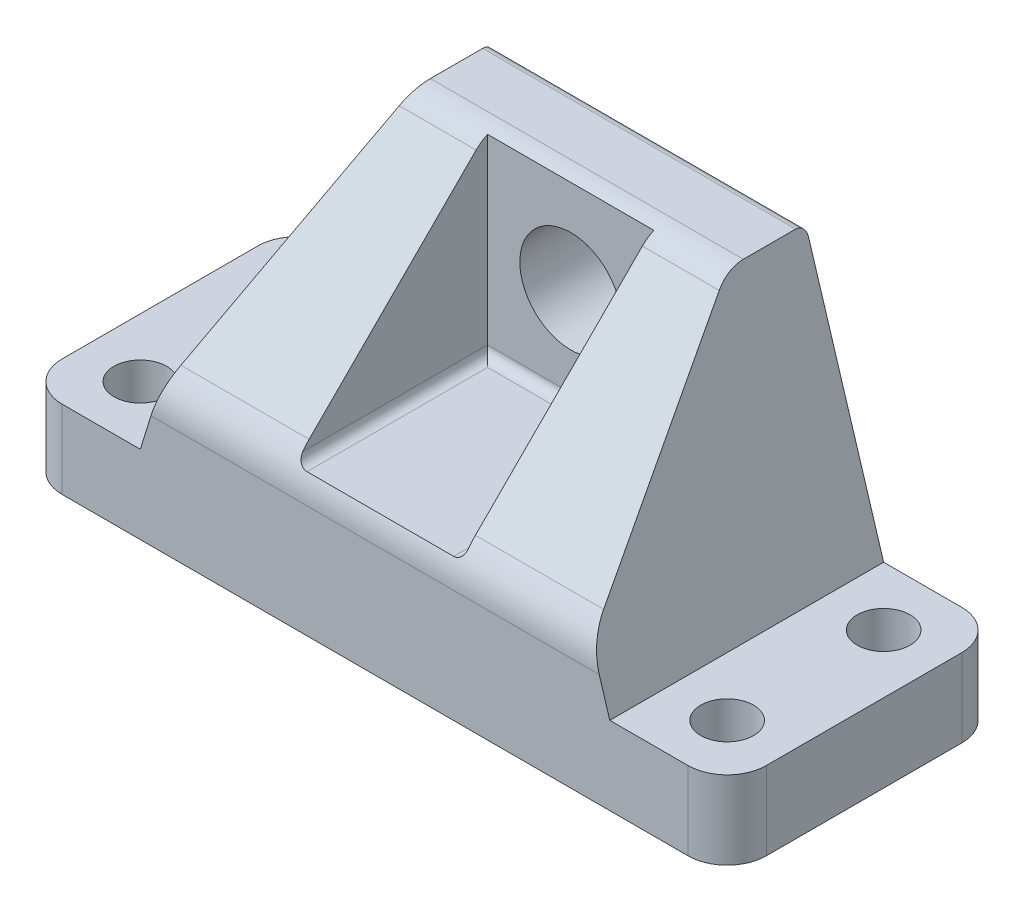
ISO-10303-21;
HEADER;
FILE_DESCRIPTION(('STEP AP214'),'2;1');
FILE_NAME('part.step','',(''),(''),'','','');
FILE_SCHEMA(('AUTOMOTIVE_DESIGN { 1 0 10303 214 1 1 1 1 }'));
ENDSEC;
DATA;
#1=APPLICATION_CONTEXT('core data for automotive mechanical design processes');
#2=APPLICATION_PROTOCOL_DEFINITION('international standard','automotive_design',2000,#1);
#3=PRODUCT_CONTEXT('',#1,'mechanical');
#4=PRODUCT('Part','Part','',(#3));
#5=PRODUCT_RELATED_PRODUCT_CATEGORY('part','',(#4));
#6=PRODUCT_DEFINITION_FORMATION('','',#4);
#7=PRODUCT_DEFINITION_CONTEXT('part definition',#1,'design');
#8=PRODUCT_DEFINITION('design','',#6,#7);
#9=PRODUCT_DEFINITION_SHAPE('','',#8);
#10=(LENGTH_UNIT() NAMED_UNIT(*) SI_UNIT(.MILLI.,.METRE.));
#11=(NAMED_UNIT(*) PLANE_ANGLE_UNIT() SI_UNIT($,.RADIAN.));
#12=(NAMED_UNIT(*) SI_UNIT($,.STERADIAN.) SOLID_ANGLE_UNIT());
#13=UNCERTAINTY_MEASURE_WITH_UNIT(LENGTH_MEASURE(1.E-05),#10,'distance_accuracy_value','');
#14=(GEOMETRIC_REPRESENTATION_CONTEXT(3) GLOBAL_UNCERTAINTY_ASSIGNED_CONTEXT((#13)) GLOBAL_UNIT_ASSIGNED_CONTEXT((#10,
#11,#12)) REPRESENTATION_CONTEXT('',''));
#15=CARTESIAN_POINT('',(0.,0.,0.));
#16=DIRECTION('',(0.,0.,1.));
#17=DIRECTION('',(1.,0.,0.));
#18=AXIS2_PLACEMENT_3D('',#15,#16,#17);
#19=CARTESIAN_POINT('',(12.,15.,-3.82842712474619));
#20=DIRECTION('',(1.,0.,0.));
#21=DIRECTION('',(0.,0.,-1.));
#22=AXIS2_PLACEMENT_3D('',#19,#20,#21);
#23=CYLINDRICAL_SURFACE('',#22,2.);
#24=CARTESIAN_POINT('',(-8.61538461538461,15.,-3.82842712474619));
#25=DIRECTION('',(0.95577900872195,-0.294085848837523,0.));
#26=DIRECTION('',(0.294085848837523,0.95577900872195,0.));
#27=AXIS2_PLACEMENT_3D('',#24,#25,#26);
#28=ELLIPSE('',#27,2.09253392442084,2.);
#29=CARTESIAN_POINT('',(-8.18024198080828,16.4142135623731,-2.41421356237309));
#30=VERTEX_POINT('',#29);
#31=CARTESIAN_POINT('',(-8.,17.,-3.82842712474619));
#32=VERTEX_POINT('',#31);
#33=EDGE_CURVE('E395',#30,#32,#28,.F.);
#34=ORIENTED_EDGE('',*,*,#33,.F.);
#35=DIRECTION('',(1.,0.,0.));
#36=VECTOR('',#35,1.);
#37=CARTESIAN_POINT('',(12.,16.4142135623731,-2.4142135623731));
#38=LINE('',#37,#36);
#39=CARTESIAN_POINT('',(-4.25,16.4142135623731,-2.41421356237309));
#40=VERTEX_POINT('',#39);
#41=EDGE_CURVE('E306',#40,#30,#38,.F.);
#42=ORIENTED_EDGE('',*,*,#41,.F.);
#43=CARTESIAN_POINT('',(-4.25,15.,-3.82842712474619));
#44=DIRECTION('',(-1.,0.,0.));
#45=DIRECTION('',(0.,-1.,0.));
#46=AXIS2_PLACEMENT_3D('',#43,#44,#45);
#47=CIRCLE('',#46,2.);
#48=CARTESIAN_POINT('',(-4.25,16.8203594422489,-3.));
#49=VERTEX_POINT('',#48);
#50=EDGE_CURVE('E303',#49,#40,#47,.F.);
#51=ORIENTED_EDGE('',*,*,#50,.F.);
#52=DIRECTION('',(1.,0.,0.));
#53=VECTOR('',#52,1.);
#54=CARTESIAN_POINT('',(12.,16.8203594422489,-3.));
#55=LINE('',#54,#53);
#56=CARTESIAN_POINT('',(4.25,16.8203594422489,-3.));
#57=VERTEX_POINT('',#56);
#58=EDGE_CURVE('E300',#57,#49,#55,.F.);
#59=ORIENTED_EDGE('',*,*,#58,.F.);
#60=CARTESIAN_POINT('',(4.25,15.,-3.82842712474619));
#61=DIRECTION('',(1.,0.,0.));
#62=DIRECTION('',(0.,1.,0.));
#63=AXIS2_PLACEMENT_3D('',#60,#61,#62);
#64=CIRCLE('',#63,2.);
#65=CARTESIAN_POINT('',(4.25,16.4142135623731,-2.4142135623731));
#66=VERTEX_POINT('',#65);
#67=EDGE_CURVE('E297',#66,#57,#64,.F.);
#68=ORIENTED_EDGE('',*,*,#67,.F.);
#69=DIRECTION('',(1.,0.,0.));
#70=VECTOR('',#69,1.);
#71=CARTESIAN_POINT('',(12.,16.4142135623731,-2.4142135623731));
#72=LINE('',#71,#70);
#73=CARTESIAN_POINT('',(8.18024198080828,16.4142135623731,-2.4142135623731));
#74=VERTEX_POINT('',#73);
#75=EDGE_CURVE('E295',#74,#66,#72,.F.);
#76=ORIENTED_EDGE('',*,*,#75,.F.);
#77=CARTESIAN_POINT('',(8.61538461538462,15.,-3.82842712474619));
#78=DIRECTION('',(-0.95577900872195,-0.294085848837523,0.));
#79=DIRECTION('',(0.294085848837523,-0.95577900872195,0.));
#80=AXIS2_PLACEMENT_3D('',#77,#78,#79);
#81=ELLIPSE('',#80,2.09253392442084,2.);
#82=CARTESIAN_POINT('',(8.,17.,-3.82842712474619));
#83=VERTEX_POINT('',#82);
#84=EDGE_CURVE('E484',#83,#74,#81,.F.);
#85=ORIENTED_EDGE('',*,*,#84,.F.);
#86=DIRECTION('',(1.,0.,0.));
#87=VECTOR('',#86,1.);
#88=CARTESIAN_POINT('',(12.,17.,-3.82842712474619));
#89=LINE('',#88,#87);
#90=EDGE_CURVE('E292',#32,#83,#89,.T.);
#91=ORIENTED_EDGE('',*,*,#90,.F.);
#92=EDGE_LOOP('',(#34,#42,#51,#59,#68,#76,#85,#91));
#93=FACE_BOUND('',#92,.T.);
#94=ADVANCED_FACE('F35',(#93),#23,.T.);
#95=CARTESIAN_POINT('',(12.,5.75735931288072,4.));
#96=DIRECTION('',(1.,0.,0.));
#97=DIRECTION('',(0.,0.,-1.));
#98=AXIS2_PLACEMENT_3D('',#95,#96,#97);
#99=CYLINDRICAL_SURFACE('',#98,3.);
#100=CARTESIAN_POINT('',(-11.4592740575752,5.75735931288072,4.));
#101=DIRECTION('',(0.95577900872195,-0.294085848837523,0.));
#102=DIRECTION('',(0.294085848837523,0.95577900872195,0.));
#103=AXIS2_PLACEMENT_3D('',#100,#101,#102);
#104=ELLIPSE('',#103,3.13880088663126,3.);
#105=CARTESIAN_POINT('',(-11.4592740575752,5.75735931288071,7.));
#106=VERTEX_POINT('',#105);
#107=CARTESIAN_POINT('',(-10.8065601057107,7.87867965644036,6.12132034355964));
#108=VERTEX_POINT('',#107);
#109=EDGE_CURVE('E398',#106,#108,#104,.F.);
#110=ORIENTED_EDGE('',*,*,#109,.F.);
#111=DIRECTION('',(1.,0.,0.));
#112=VECTOR('',#111,1.);
#113=CARTESIAN_POINT('',(-18.,5.75735931288072,7.));
#114=LINE('',#113,#112);
#115=CARTESIAN_POINT('',(11.4592740575752,5.75735931288071,7.));
#116=VERTEX_POINT('',#115);
#117=EDGE_CURVE('E210',#116,#106,#114,.F.);
#118=ORIENTED_EDGE('',*,*,#117,.F.);
#119=CARTESIAN_POINT('',(11.4592740575752,5.75735931288072,4.));
#120=DIRECTION('',(-0.95577900872195,-0.294085848837523,0.));
#121=DIRECTION('',(0.294085848837523,-0.95577900872195,0.));
#122=AXIS2_PLACEMENT_3D('',#119,#120,#121);
#123=ELLIPSE('',#122,3.13880088663126,3.);
#124=CARTESIAN_POINT('',(10.8065601057107,7.87867965644036,6.12132034355964));
#125=VERTEX_POINT('',#124);
#126=EDGE_CURVE('E482',#125,#116,#123,.F.);
#127=ORIENTED_EDGE('',*,*,#126,.F.);
#128=DIRECTION('',(1.,0.,0.));
#129=VECTOR('',#128,1.);
#130=CARTESIAN_POINT('',(12.,7.87867965644036,6.12132034355964));
#131=LINE('',#130,#129);
#132=CARTESIAN_POINT('',(4.25,7.87867965644036,6.12132034355964));
#133=VERTEX_POINT('',#132);
#134=EDGE_CURVE('E244',#133,#125,#131,.T.);
#135=ORIENTED_EDGE('',*,*,#134,.F.);
#136=CARTESIAN_POINT('',(4.25,5.75735931288072,4.));
#137=DIRECTION('',(1.,0.,0.));
#138=DIRECTION('',(0.,1.,0.));
#139=AXIS2_PLACEMENT_3D('',#136,#137,#138);
#140=CIRCLE('',#139,3.);
#141=CARTESIAN_POINT('',(4.25,7.5,6.4419671241842));
#142=VERTEX_POINT('',#141);
#143=EDGE_CURVE('E256',#142,#133,#140,.F.);
#144=ORIENTED_EDGE('',*,*,#143,.F.);
#145=CARTESIAN_POINT('',(4.25,7.5,6.4419671241842));
#146=CARTESIAN_POINT('',(4.24999537341047,7.48268297137033,6.45432591437755));
#147=CARTESIAN_POINT('',(4.24909879375324,7.46524185402877,6.4664924923008));
#148=CARTESIAN_POINT('',(4.24542138268199,7.43021329051605,6.49038359998436));
#149=CARTESIAN_POINT('',(4.2426373021105,7.41262564375759,6.50210733062476));
#150=CARTESIAN_POINT('',(4.23128980678927,7.359806176605,6.53651687406879));
#151=CARTESIAN_POINT('',(4.21973022630683,7.32459881042094,6.55838338193296));
#152=CARTESIAN_POINT('',(4.19260258426947,7.26581925926679,6.59333362814945));
#153=CARTESIAN_POINT('',(4.17905435714897,7.24174270658191,6.60716510563831));
#154=CARTESIAN_POINT('',(4.14760333731502,7.19555215495189,6.63292536752843));
#155=CARTESIAN_POINT('',(4.12971145767155,7.17343342427515,6.64485879815643));
#156=CARTESIAN_POINT('',(4.08965579559431,7.13193661223656,6.6666630881647));
#157=CARTESIAN_POINT('',(4.06746694450351,7.11257583133172,6.67652109827895));
#158=CARTESIAN_POINT('',(4.01938268861604,7.07772823379224,6.6938832218961));
#159=CARTESIAN_POINT('',(3.99348563530268,7.06224314859362,6.70138628372359));
#160=CARTESIAN_POINT('',(3.94156322001128,7.03734514542957,6.71326519917483));
#161=CARTESIAN_POINT('',(3.91580700708023,7.02748135585169,6.71787792629022));
#162=CARTESIAN_POINT('',(3.86277842393049,7.01210718561428,6.72501027025092));
#163=CARTESIAN_POINT('',(3.8355092486044,7.00658797903175,6.7275341311206));
#164=CARTESIAN_POINT('',(3.7983387435642,7.00224713439507,6.72951553815885));
#165=CARTESIAN_POINT('',(3.78868622156646,7.00140438605481,6.72989965773296));
#166=CARTESIAN_POINT('',(3.76935739544513,7.00028156522248,6.73041109568538));
#167=CARTESIAN_POINT('',(3.759681155075,7.00000058448219,6.73053882858294));
#168=CARTESIAN_POINT('',(3.75000000000002,6.99999999999997,6.73053916337367));
#169=B_SPLINE_CURVE_WITH_KNOTS('',3,(#145,#146,#147,#148,#149,#150,#151,#152,#153,#154,#155,
#156,#157,#158,#159,#160,#161,#162,#163,#164,#165,#166,#167,#168),.UNSPECIFIED.,.F.,.F.,(4,2,2,
2,2,2,2,2,2,2,2,4),(0.,0.063778552588734,0.127667173733693,0.255738180117637,0.348057065299247,
0.440146364535525,0.532790046145757,0.625475041999674,0.708937967930507,0.792230900053666,
0.821306694855086,0.850335442686333),.UNSPECIFIED.);
#170=CARTESIAN_POINT('',(3.75,6.99999999999999,6.73053916337337));
#171=VERTEX_POINT('',#170);
#172=EDGE_CURVE('E334',#142,#171,#169,.T.);
#173=ORIENTED_EDGE('',*,*,#172,.T.);
#174=DIRECTION('',(1.,0.,0.));
#175=VECTOR('',#174,1.);
#176=CARTESIAN_POINT('',(12.,6.99999999999999,6.73053916337337));
#177=LINE('',#176,#175);
#178=CARTESIAN_POINT('',(-3.75,6.99999999999999,6.73053916337337));
#179=VERTEX_POINT('',#178);
#180=EDGE_CURVE('E253',#179,#171,#177,.T.);
#181=ORIENTED_EDGE('',*,*,#180,.F.);
#182=CARTESIAN_POINT('',(-3.75,7.,6.73053916337337));
#183=CARTESIAN_POINT('',(-3.77608291545325,6.99996877187642,6.73054263866578));
#184=CARTESIAN_POINT('',(-3.80214997808737,7.00203888512997,6.72961119200272));
#185=CARTESIAN_POINT('',(-3.85345917177339,7.01014238586,6.72590713864733));
#186=CARTESIAN_POINT('',(-3.87870326420308,7.01616549649679,6.72313930591256));
#187=CARTESIAN_POINT('',(-3.92771440868963,7.03193734022698,6.71579114411604));
#188=CARTESIAN_POINT('',(-3.95148154953399,7.04168584911428,6.71121092412882));
#189=CARTESIAN_POINT('',(-3.99693472554677,7.06448931115143,6.70029099787344));
#190=CARTESIAN_POINT('',(-4.01862010948823,7.07754529434629,6.69395074341963));
#191=CARTESIAN_POINT('',(-4.05993080045945,7.106808184061,6.67941411039386));
#192=CARTESIAN_POINT('',(-4.0794907089138,7.12308597604966,6.67117512354551));
#193=CARTESIAN_POINT('',(-4.11554708320106,7.1579408203488,6.65306558336189));
#194=CARTESIAN_POINT('',(-4.13204368901089,7.1765177675352,6.64319510461624));
#195=CARTESIAN_POINT('',(-4.16296850619896,7.21688568912859,6.62113547637902));
#196=CARTESIAN_POINT('',(-4.1771287956358,7.23881472404126,6.60882450107077));
#197=CARTESIAN_POINT('',(-4.20162821431148,7.28391583083343,6.58269399031772));
#198=CARTESIAN_POINT('',(-4.21196056415058,7.30709002563098,6.56887183404493));
#199=CARTESIAN_POINT('',(-4.23051065777777,7.35858729827377,6.53715253170275));
#200=CARTESIAN_POINT('',(-4.23792249569317,7.38703278521749,6.51898649373849));
#201=CARTESIAN_POINT('',(-4.24766402458841,7.44379509696796,6.48135541051037));
#202=CARTESIAN_POINT('',(-4.2500120800453,7.47211201377874,6.46189532398454));
#203=CARTESIAN_POINT('',(-4.25,7.5,6.4419671241842));
#204=B_SPLINE_CURVE_WITH_KNOTS('',3,(#182,#183,#184,#185,#186,#187,#188,#189,#190,#191,#192,
#193,#194,#195,#196,#197,#198,#199,#200,#201,#202,#203),.UNSPECIFIED.,.F.,.F.,(4,2,2,2,2,2,2,2,
2,2,4),(0.,0.0781257324773792,0.156049157192285,0.233967892970661,0.311910924836296,
0.391811035622077,0.471707494491279,0.557942462805597,0.644329434002453,0.747571284235488,
0.850438080155522),.UNSPECIFIED.);
#205=CARTESIAN_POINT('',(-4.25,7.5,6.4419671241842));
#206=VERTEX_POINT('',#205);
#207=EDGE_CURVE('E328',#179,#206,#204,.T.);
#208=ORIENTED_EDGE('',*,*,#207,.T.);
#209=CARTESIAN_POINT('',(-4.25,5.75735931288072,4.));
#210=DIRECTION('',(-1.,0.,0.));
#211=DIRECTION('',(0.,-1.,0.));
#212=AXIS2_PLACEMENT_3D('',#209,#210,#211);
#213=CIRCLE('',#212,3.);
#214=CARTESIAN_POINT('',(-4.25,7.87867965644036,6.12132034355964));
#215=VERTEX_POINT('',#214);
#216=EDGE_CURVE('E250',#215,#206,#213,.F.);
#217=ORIENTED_EDGE('',*,*,#216,.F.);
#218=DIRECTION('',(1.,0.,0.));
#219=VECTOR('',#218,1.);
#220=CARTESIAN_POINT('',(12.,7.87867965644036,6.12132034355964));
#221=LINE('',#220,#219);
#222=EDGE_CURVE('E248',#108,#215,#221,.T.);
#223=ORIENTED_EDGE('',*,*,#222,.F.);
#224=EDGE_LOOP('',(#110,#118,#127,#135,#144,#173,#181,#208,#217,#223));
#225=FACE_BOUND('',#224,.T.);
#226=ADVANCED_FACE('F342',(#225),#99,.T.);
#227=CARTESIAN_POINT('',(12.,17.,-3.));
#228=DIRECTION('',(0.,-0.707106781186548,-0.707106781186547));
#229=DIRECTION('',(0.,0.707106781186547,-0.707106781186548));
#230=AXIS2_PLACEMENT_3D('',#227,#228,#229);
#231=PLANE('',#230);
#232=ORIENTED_EDGE('',*,*,#134,.T.);
#233=DIRECTION('',(-0.212597601381093,0.690942204488554,-0.690942204488554));
#234=VECTOR('',#233,1.);
#235=CARTESIAN_POINT('',(8.18079096045198,16.4124293785311,-2.41242937853107));
#236=LINE('',#235,#234);
#237=EDGE_CURVE('E479',#125,#74,#236,.T.);
#238=ORIENTED_EDGE('',*,*,#237,.T.);
#239=ORIENTED_EDGE('',*,*,#75,.T.);
#240=DIRECTION('',(0.,-0.707106781186547,0.707106781186548));
#241=VECTOR('',#240,1.);
#242=CARTESIAN_POINT('',(4.25,17.,-3.));
#243=LINE('',#242,#241);
#244=EDGE_CURVE('E221',#66,#133,#243,.T.);
#245=ORIENTED_EDGE('',*,*,#244,.T.);
#246=EDGE_LOOP('',(#232,#238,#239,#245));
#247=FACE_BOUND('',#246,.T.);
#248=ADVANCED_FACE('F347',(#247),#231,.F.);
#249=CARTESIAN_POINT('',(0.,4.,0.));
#250=DIRECTION('',(0.,-1.,0.));
#251=DIRECTION('',(0.,0.,-1.));
#252=AXIS2_PLACEMENT_3D('',#249,#250,#251);
#253=PLANE('',#252);
#254=CARTESIAN_POINT('',(15.,4.,4.));
#255=DIRECTION('',(0.,1.,0.));
#256=DIRECTION('',(0.,0.,-1.));
#257=AXIS2_PLACEMENT_3D('',#254,#255,#256);
#258=CIRCLE('',#257,1.35);
#259=CARTESIAN_POINT('',(15.,4.,2.65));
#260=VERTEX_POINT('',#259);
#261=EDGE_CURVE('E416',#260,#260,#258,.T.);
#262=ORIENTED_EDGE('',*,*,#261,.F.);
#263=EDGE_LOOP('',(#262));
#264=FACE_BOUND('',#263,.T.);
#265=CARTESIAN_POINT('',(15.,4.,-4.));
#266=DIRECTION('',(0.,1.,0.));
#267=DIRECTION('',(0.,0.,1.));
#268=AXIS2_PLACEMENT_3D('',#265,#266,#267);
#269=CIRCLE('',#268,1.35);
#270=CARTESIAN_POINT('',(15.,4.,-2.65));
#271=VERTEX_POINT('',#270);
#272=EDGE_CURVE('E422',#271,#271,#269,.T.);
#273=ORIENTED_EDGE('',*,*,#272,.F.);
#274=EDGE_LOOP('',(#273));
#275=FACE_BOUND('',#274,.T.);
#276=DIRECTION('',(0.,0.,-1.));
#277=VECTOR('',#276,1.);
#278=CARTESIAN_POINT('',(18.,4.,7.));
#279=LINE('',#278,#277);
#280=CARTESIAN_POINT('',(18.,4.,5.));
#281=VERTEX_POINT('',#280);
#282=CARTESIAN_POINT('',(18.,4.,-5.));
#283=VERTEX_POINT('',#282);
#284=EDGE_CURVE('E240',#281,#283,#279,.T.);
#285=ORIENTED_EDGE('',*,*,#284,.T.);
#286=CARTESIAN_POINT('',(16.,4.,-5.));
#287=DIRECTION('',(0.,-1.,0.));
#288=DIRECTION('',(0.,0.,-1.));
#289=AXIS2_PLACEMENT_3D('',#286,#287,#288);
#290=CIRCLE('',#289,2.);
#291=CARTESIAN_POINT('',(16.,4.,-7.));
#292=VERTEX_POINT('',#291);
#293=EDGE_CURVE('E278',#283,#292,#290,.F.);
#294=ORIENTED_EDGE('',*,*,#293,.T.);
#295=DIRECTION('',(-1.,0.,0.));
#296=VECTOR('',#295,1.);
#297=CARTESIAN_POINT('',(-18.,4.,-7.));
#298=LINE('',#297,#296);
#299=CARTESIAN_POINT('',(12.,4.,-7.));
#300=VERTEX_POINT('',#299);
#301=EDGE_CURVE('E440',#292,#300,#298,.T.);
#302=ORIENTED_EDGE('',*,*,#301,.T.);
#303=DIRECTION('',(0.,0.,-1.));
#304=VECTOR('',#303,1.);
#305=CARTESIAN_POINT('',(12.,4.,-7.));
#306=LINE('',#305,#304);
#307=CARTESIAN_POINT('',(12.,4.,7.));
#308=VERTEX_POINT('',#307);
#309=EDGE_CURVE('E198',#308,#300,#306,.T.);
#310=ORIENTED_EDGE('',*,*,#309,.F.);
#311=DIRECTION('',(1.,0.,0.));
#312=VECTOR('',#311,1.);
#313=CARTESIAN_POINT('',(-18.,4.,7.));
#314=LINE('',#313,#312);
#315=CARTESIAN_POINT('',(16.,4.,7.));
#316=VERTEX_POINT('',#315);
#317=EDGE_CURVE('E218',#308,#316,#314,.T.);
#318=ORIENTED_EDGE('',*,*,#317,.T.);
#319=CARTESIAN_POINT('',(16.,4.,5.));
#320=DIRECTION('',(0.,-1.,0.));
#321=DIRECTION('',(0.,0.,-1.));
#322=AXIS2_PLACEMENT_3D('',#319,#320,#321);
#323=CIRCLE('',#322,2.);
#324=EDGE_CURVE('E276',#316,#281,#323,.F.);
#325=ORIENTED_EDGE('',*,*,#324,.T.);
#326=EDGE_LOOP('',(#285,#294,#302,#310,#318,#325));
#327=FACE_BOUND('',#326,.T.);
#328=ADVANCED_FACE('F464',(#264,#275,#327),#253,.F.);
#329=CARTESIAN_POINT('',(-12.,4.,-7.));
#330=VERTEX_POINT('',#329);
#331=CARTESIAN_POINT('',(-16.,4.,-7.));
#332=VERTEX_POINT('',#331);
#333=EDGE_CURVE('E439',#330,#332,#298,.T.);
#334=ORIENTED_EDGE('',*,*,#333,.T.);
#335=CARTESIAN_POINT('',(-16.,4.,-5.));
#336=DIRECTION('',(0.,-1.,0.));
#337=DIRECTION('',(0.,0.,-1.));
#338=AXIS2_PLACEMENT_3D('',#335,#336,#337);
#339=CIRCLE('',#338,2.);
#340=CARTESIAN_POINT('',(-18.,4.,-5.));
#341=VERTEX_POINT('',#340);
#342=EDGE_CURVE('E286',#332,#341,#339,.F.);
#343=ORIENTED_EDGE('',*,*,#342,.T.);
#344=DIRECTION('',(0.,0.,1.));
#345=VECTOR('',#344,1.);
#346=CARTESIAN_POINT('',(-18.,4.,7.));
#347=LINE('',#346,#345);
#348=CARTESIAN_POINT('',(-18.,4.,5.));
#349=VERTEX_POINT('',#348);
#350=EDGE_CURVE('E224',#341,#349,#347,.T.);
#351=ORIENTED_EDGE('',*,*,#350,.T.);
#352=CARTESIAN_POINT('',(-16.,4.,5.));
#353=DIRECTION('',(0.,-1.,0.));
#354=DIRECTION('',(0.,0.,-1.));
#355=AXIS2_PLACEMENT_3D('',#352,#353,#354);
#356=CIRCLE('',#355,2.);
#357=CARTESIAN_POINT('',(-16.,4.,7.));
#358=VERTEX_POINT('',#357);
#359=EDGE_CURVE('E216',#349,#358,#356,.F.);
#360=ORIENTED_EDGE('',*,*,#359,.T.);
#361=CARTESIAN_POINT('',(-12.,4.,7.));
#362=VERTEX_POINT('',#361);
#363=EDGE_CURVE('E206',#358,#362,#314,.T.);
#364=ORIENTED_EDGE('',*,*,#363,.T.);
#365=DIRECTION('',(0.,0.,-1.));
#366=VECTOR('',#365,1.);
#367=CARTESIAN_POINT('',(-12.,4.,-7.));
#368=LINE('',#367,#366);
#369=EDGE_CURVE('E187',#362,#330,#368,.T.);
#370=ORIENTED_EDGE('',*,*,#369,.T.);
#371=EDGE_LOOP('',(#334,#343,#351,#360,#364,#370));
#372=FACE_BOUND('',#371,.T.);
#373=CARTESIAN_POINT('',(-15.,4.,4.));
#374=DIRECTION('',(0.,1.,0.));
#375=DIRECTION('',(0.,0.,1.));
#376=AXIS2_PLACEMENT_3D('',#373,#374,#375);
#377=CIRCLE('',#376,1.35);
#378=CARTESIAN_POINT('',(-15.,4.,5.35));
#379=VERTEX_POINT('',#378);
#380=EDGE_CURVE('E232',#379,#379,#377,.T.);
#381=ORIENTED_EDGE('',*,*,#380,.F.);
#382=EDGE_LOOP('',(#381));
#383=FACE_BOUND('',#382,.T.);
#384=CARTESIAN_POINT('',(-15.,4.,-4.));
#385=DIRECTION('',(0.,1.,0.));
#386=DIRECTION('',(0.,0.,-1.));
#387=AXIS2_PLACEMENT_3D('',#384,#385,#386);
#388=CIRCLE('',#387,1.35);
#389=CARTESIAN_POINT('',(-15.,4.,-5.35));
#390=VERTEX_POINT('',#389);
#391=EDGE_CURVE('E428',#390,#390,#388,.T.);
#392=ORIENTED_EDGE('',*,*,#391,.F.);
#393=EDGE_LOOP('',(#392));
#394=FACE_BOUND('',#393,.T.);
#395=ADVANCED_FACE('F212',(#372,#383,#394),#253,.F.);
#396=CARTESIAN_POINT('',(0.,0.,0.));
#397=DIRECTION('',(0.,-1.,0.));
#398=DIRECTION('',(0.,0.,-1.));
#399=AXIS2_PLACEMENT_3D('',#396,#397,#398);
#400=PLANE('',#399);
#401=CARTESIAN_POINT('',(15.,0.,-4.));
#402=DIRECTION('',(0.,1.,0.));
#403=DIRECTION('',(0.,0.,1.));
#404=AXIS2_PLACEMENT_3D('',#401,#402,#403);
#405=CIRCLE('',#404,1.35);
#406=CARTESIAN_POINT('',(15.,0.,-2.65));
#407=VERTEX_POINT('',#406);
#408=EDGE_CURVE('E419',#407,#407,#405,.T.);
#409=ORIENTED_EDGE('',*,*,#408,.T.);
#410=EDGE_LOOP('',(#409));
#411=FACE_BOUND('',#410,.T.);
#412=CARTESIAN_POINT('',(-15.,0.,4.));
#413=DIRECTION('',(0.,1.,0.));
#414=DIRECTION('',(0.,0.,1.));
#415=AXIS2_PLACEMENT_3D('',#412,#413,#414);
#416=CIRCLE('',#415,1.35);
#417=CARTESIAN_POINT('',(-15.,0.,5.35));
#418=VERTEX_POINT('',#417);
#419=EDGE_CURVE('E431',#418,#418,#416,.T.);
#420=ORIENTED_EDGE('',*,*,#419,.T.);
#421=EDGE_LOOP('',(#420));
#422=FACE_BOUND('',#421,.T.);
#423=DIRECTION('',(-1.,0.,0.));
#424=VECTOR('',#423,1.);
#425=CARTESIAN_POINT('',(-18.,0.,-7.));
#426=LINE('',#425,#424);
#427=CARTESIAN_POINT('',(16.,0.,-7.));
#428=VERTEX_POINT('',#427);
#429=CARTESIAN_POINT('',(-16.,0.,-7.));
#430=VERTEX_POINT('',#429);
#431=EDGE_CURVE('E231',#428,#430,#426,.T.);
#432=ORIENTED_EDGE('',*,*,#431,.F.);
#433=CARTESIAN_POINT('',(16.,0.,-5.));
#434=DIRECTION('',(0.,-1.,0.));
#435=DIRECTION('',(0.,0.,-1.));
#436=AXIS2_PLACEMENT_3D('',#433,#434,#435);
#437=CIRCLE('',#436,2.);
#438=CARTESIAN_POINT('',(18.,0.,-5.));
#439=VERTEX_POINT('',#438);
#440=EDGE_CURVE('E269',#428,#439,#437,.T.);
#441=ORIENTED_EDGE('',*,*,#440,.T.);
#442=DIRECTION('',(0.,0.,-1.));
#443=VECTOR('',#442,1.);
#444=CARTESIAN_POINT('',(18.,0.,7.));
#445=LINE('',#444,#443);
#446=CARTESIAN_POINT('',(18.,0.,5.));
#447=VERTEX_POINT('',#446);
#448=EDGE_CURVE('E228',#447,#439,#445,.T.);
#449=ORIENTED_EDGE('',*,*,#448,.F.);
#450=CARTESIAN_POINT('',(16.,0.,5.));
#451=DIRECTION('',(0.,-1.,0.));
#452=DIRECTION('',(0.,0.,-1.));
#453=AXIS2_PLACEMENT_3D('',#450,#451,#452);
#454=CIRCLE('',#453,2.);
#455=CARTESIAN_POINT('',(16.,0.,7.));
#456=VERTEX_POINT('',#455);
#457=EDGE_CURVE('E265',#447,#456,#454,.T.);
#458=ORIENTED_EDGE('',*,*,#457,.T.);
#459=DIRECTION('',(1.,0.,0.));
#460=VECTOR('',#459,1.);
#461=CARTESIAN_POINT('',(-18.,0.,7.));
#462=LINE('',#461,#460);
#463=CARTESIAN_POINT('',(-16.,0.,7.));
#464=VERTEX_POINT('',#463);
#465=EDGE_CURVE('E238',#464,#456,#462,.T.);
#466=ORIENTED_EDGE('',*,*,#465,.F.);
#467=CARTESIAN_POINT('',(-16.,0.,5.));
#468=DIRECTION('',(0.,-1.,0.));
#469=DIRECTION('',(0.,0.,-1.));
#470=AXIS2_PLACEMENT_3D('',#467,#468,#469);
#471=CIRCLE('',#470,2.);
#472=CARTESIAN_POINT('',(-18.,0.,5.));
#473=VERTEX_POINT('',#472);
#474=EDGE_CURVE('E263',#464,#473,#471,.T.);
#475=ORIENTED_EDGE('',*,*,#474,.T.);
#476=DIRECTION('',(0.,0.,1.));
#477=VECTOR('',#476,1.);
#478=CARTESIAN_POINT('',(-18.,0.,7.));
#479=LINE('',#478,#477);
#480=CARTESIAN_POINT('',(-18.,0.,-5.));
#481=VERTEX_POINT('',#480);
#482=EDGE_CURVE('E235',#481,#473,#479,.T.);
#483=ORIENTED_EDGE('',*,*,#482,.F.);
#484=CARTESIAN_POINT('',(-16.,0.,-5.));
#485=DIRECTION('',(0.,-1.,0.));
#486=DIRECTION('',(0.,0.,-1.));
#487=AXIS2_PLACEMENT_3D('',#484,#485,#486);
#488=CIRCLE('',#487,2.);
#489=EDGE_CURVE('E267',#481,#430,#488,.T.);
#490=ORIENTED_EDGE('',*,*,#489,.T.);
#491=EDGE_LOOP('',(#432,#441,#449,#458,#466,#475,#483,#490));
#492=FACE_BOUND('',#491,.T.);
#493=CARTESIAN_POINT('',(-15.,0.,-4.));
#494=DIRECTION('',(0.,1.,0.));
#495=DIRECTION('',(0.,0.,-1.));
#496=AXIS2_PLACEMENT_3D('',#493,#494,#495);
#497=CIRCLE('',#496,1.35);
#498=CARTESIAN_POINT('',(-15.,0.,-5.35));
#499=VERTEX_POINT('',#498);
#500=EDGE_CURVE('E425',#499,#499,#497,.T.);
#501=ORIENTED_EDGE('',*,*,#500,.T.);
#502=EDGE_LOOP('',(#501));
#503=FACE_BOUND('',#502,.T.);
#504=CARTESIAN_POINT('',(15.,0.,4.));
#505=DIRECTION('',(0.,1.,0.));
#506=DIRECTION('',(0.,0.,-1.));
#507=AXIS2_PLACEMENT_3D('',#504,#505,#506);
#508=CIRCLE('',#507,1.35);
#509=CARTESIAN_POINT('',(15.,0.,2.65));
#510=VERTEX_POINT('',#509);
#511=EDGE_CURVE('E414',#510,#510,#508,.T.);
#512=ORIENTED_EDGE('',*,*,#511,.T.);
#513=EDGE_LOOP('',(#512));
#514=FACE_BOUND('',#513,.T.);
#515=ADVANCED_FACE('F456',(#411,#422,#492,#503,#514),#400,.T.);
#516=CARTESIAN_POINT('',(18.,4.,7.));
#517=DIRECTION('',(-1.,0.,0.));
#518=DIRECTION('',(0.,0.,1.));
#519=AXIS2_PLACEMENT_3D('',#516,#517,#518);
#520=PLANE('',#519);
#521=ORIENTED_EDGE('',*,*,#448,.T.);
#522=DIRECTION('',(0.,-1.,0.));
#523=VECTOR('',#522,1.);
#524=CARTESIAN_POINT('',(18.,4.,-5.));
#525=LINE('',#524,#523);
#526=EDGE_CURVE('E274',#439,#283,#525,.F.);
#527=ORIENTED_EDGE('',*,*,#526,.T.);
#528=ORIENTED_EDGE('',*,*,#284,.F.);
#529=DIRECTION('',(0.,-1.,0.));
#530=VECTOR('',#529,1.);
#531=CARTESIAN_POINT('',(18.,4.,5.));
#532=LINE('',#531,#530);
#533=EDGE_CURVE('E271',#281,#447,#532,.T.);
#534=ORIENTED_EDGE('',*,*,#533,.T.);
#535=EDGE_LOOP('',(#521,#527,#528,#534));
#536=FACE_BOUND('',#535,.T.);
#537=ADVANCED_FACE('F349',(#536),#520,.F.);
#538=CARTESIAN_POINT('',(-18.,4.,-7.));
#539=DIRECTION('',(0.,0.,1.));
#540=DIRECTION('',(1.,0.,0.));
#541=AXIS2_PLACEMENT_3D('',#538,#539,#540);
#542=PLANE('',#541);
#543=CARTESIAN_POINT('',(0.,12.,-7.));
#544=DIRECTION('',(0.,0.,1.));
#545=DIRECTION('',(1.,0.,0.));
#546=AXIS2_PLACEMENT_3D('',#543,#544,#545);
#547=CIRCLE('',#546,2.6);
#548=CARTESIAN_POINT('',(2.6,12.,-7.));
#549=VERTEX_POINT('',#548);
#550=EDGE_CURVE('E405',#549,#549,#547,.T.);
#551=ORIENTED_EDGE('',*,*,#550,.T.);
#552=EDGE_LOOP('',(#551));
#553=FACE_BOUND('',#552,.T.);
#554=ORIENTED_EDGE('',*,*,#333,.F.);
#555=DIRECTION('',(-0.294085848837523,-0.95577900872195,0.));
#556=VECTOR('',#555,1.);
#557=CARTESIAN_POINT('',(-12.,4.,-7.));
#558=LINE('',#557,#556);
#559=CARTESIAN_POINT('',(-8.15384615384615,16.5,-7.));
#560=VERTEX_POINT('',#559);
#561=EDGE_CURVE('E193',#560,#330,#558,.T.);
#562=ORIENTED_EDGE('',*,*,#561,.F.);
#563=DIRECTION('',(-1.,0.,0.));
#564=VECTOR('',#563,1.);
#565=CARTESIAN_POINT('',(-18.,16.5,-7.));
#566=LINE('',#565,#564);
#567=CARTESIAN_POINT('',(8.15384615384615,16.5,-7.));
#568=VERTEX_POINT('',#567);
#569=EDGE_CURVE('E325',#560,#568,#566,.F.);
#570=ORIENTED_EDGE('',*,*,#569,.T.);
#571=DIRECTION('',(-0.294085848837523,0.95577900872195,0.));
#572=VECTOR('',#571,1.);
#573=CARTESIAN_POINT('',(12.,4.,-7.));
#574=LINE('',#573,#572);
#575=EDGE_CURVE('E57',#300,#568,#574,.T.);
#576=ORIENTED_EDGE('',*,*,#575,.F.);
#577=ORIENTED_EDGE('',*,*,#301,.F.);
#578=DIRECTION('',(0.,-1.,0.));
#579=VECTOR('',#578,1.);
#580=CARTESIAN_POINT('',(16.,4.,-7.));
#581=LINE('',#580,#579);
#582=EDGE_CURVE('E260',#292,#428,#581,.T.);
#583=ORIENTED_EDGE('',*,*,#582,.T.);
#584=ORIENTED_EDGE('',*,*,#431,.T.);
#585=DIRECTION('',(0.,-1.,0.));
#586=VECTOR('',#585,1.);
#587=CARTESIAN_POINT('',(-16.,4.,-7.));
#588=LINE('',#587,#586);
#589=EDGE_CURVE('E258',#430,#332,#588,.F.);
#590=ORIENTED_EDGE('',*,*,#589,.T.);
#591=EDGE_LOOP('',(#554,#562,#570,#576,#577,#583,#584,#590));
#592=FACE_BOUND('',#591,.T.);
#593=ADVANCED_FACE('F470',(#553,#592),#542,.F.);
#594=CARTESIAN_POINT('',(-18.,4.,7.));
#595=DIRECTION('',(1.,0.,0.));
#596=DIRECTION('',(0.,0.,-1.));
#597=AXIS2_PLACEMENT_3D('',#594,#595,#596);
#598=PLANE('',#597);
#599=ORIENTED_EDGE('',*,*,#350,.F.);
#600=DIRECTION('',(0.,-1.,0.));
#601=VECTOR('',#600,1.);
#602=CARTESIAN_POINT('',(-18.,4.,-5.));
#603=LINE('',#602,#601);
#604=EDGE_CURVE('E282',#341,#481,#603,.T.);
#605=ORIENTED_EDGE('',*,*,#604,.T.);
#606=ORIENTED_EDGE('',*,*,#482,.T.);
#607=DIRECTION('',(0.,-1.,0.));
#608=VECTOR('',#607,1.);
#609=CARTESIAN_POINT('',(-18.,4.,5.));
#610=LINE('',#609,#608);
#611=EDGE_CURVE('E280',#473,#349,#610,.F.);
#612=ORIENTED_EDGE('',*,*,#611,.T.);
#613=EDGE_LOOP('',(#599,#605,#606,#612));
#614=FACE_BOUND('',#613,.T.);
#615=ADVANCED_FACE('F452',(#614),#598,.F.);
#616=CARTESIAN_POINT('',(-18.,4.,7.));
#617=DIRECTION('',(0.,0.,-1.));
#618=DIRECTION('',(-1.,0.,0.));
#619=AXIS2_PLACEMENT_3D('',#616,#617,#618);
#620=PLANE('',#619);
#621=ORIENTED_EDGE('',*,*,#117,.T.);
#622=DIRECTION('',(-0.294085848837523,-0.95577900872195,0.));
#623=VECTOR('',#622,1.);
#624=CARTESIAN_POINT('',(-12.,4.,7.));
#625=LINE('',#624,#623);
#626=EDGE_CURVE('E190',#106,#362,#625,.T.);
#627=ORIENTED_EDGE('',*,*,#626,.T.);
#628=ORIENTED_EDGE('',*,*,#363,.F.);
#629=DIRECTION('',(0.,-1.,0.));
#630=VECTOR('',#629,1.);
#631=CARTESIAN_POINT('',(-16.,4.,7.));
#632=LINE('',#631,#630);
#633=EDGE_CURVE('E288',#358,#464,#632,.T.);
#634=ORIENTED_EDGE('',*,*,#633,.T.);
#635=ORIENTED_EDGE('',*,*,#465,.T.);
#636=DIRECTION('',(0.,-1.,0.));
#637=VECTOR('',#636,1.);
#638=CARTESIAN_POINT('',(16.,4.,7.));
#639=LINE('',#638,#637);
#640=EDGE_CURVE('E290',#456,#316,#639,.F.);
#641=ORIENTED_EDGE('',*,*,#640,.T.);
#642=ORIENTED_EDGE('',*,*,#317,.F.);
#643=DIRECTION('',(-0.294085848837523,0.95577900872195,0.));
#644=VECTOR('',#643,1.);
#645=CARTESIAN_POINT('',(12.,4.,7.));
#646=LINE('',#645,#644);
#647=EDGE_CURVE('E472',#308,#116,#646,.T.);
#648=ORIENTED_EDGE('',*,*,#647,.T.);
#649=EDGE_LOOP('',(#621,#627,#628,#634,#635,#641,#642,#648));
#650=FACE_BOUND('',#649,.T.);
#651=ADVANCED_FACE('F204',(#650),#620,.F.);
#652=CARTESIAN_POINT('',(-15.,4.,4.));
#653=DIRECTION('',(0.,-1.,0.));
#654=DIRECTION('',(0.,0.,-1.));
#655=AXIS2_PLACEMENT_3D('',#652,#653,#654);
#656=CYLINDRICAL_SURFACE('',#655,1.35);
#657=ORIENTED_EDGE('',*,*,#380,.T.);
#658=EDGE_LOOP('',(#657));
#659=FACE_BOUND('',#658,.T.);
#660=ORIENTED_EDGE('',*,*,#419,.F.);
#661=EDGE_LOOP('',(#660));
#662=FACE_BOUND('',#661,.T.);
#663=ADVANCED_FACE('F556',(#659,#662),#656,.F.);
#664=CARTESIAN_POINT('',(-15.,4.,-4.));
#665=DIRECTION('',(0.,-1.,0.));
#666=DIRECTION('',(0.,0.,-1.));
#667=AXIS2_PLACEMENT_3D('',#664,#665,#666);
#668=CYLINDRICAL_SURFACE('',#667,1.35);
#669=ORIENTED_EDGE('',*,*,#391,.T.);
#670=EDGE_LOOP('',(#669));
#671=FACE_BOUND('',#670,.T.);
#672=ORIENTED_EDGE('',*,*,#500,.F.);
#673=EDGE_LOOP('',(#672));
#674=FACE_BOUND('',#673,.T.);
#675=ADVANCED_FACE('F552',(#671,#674),#668,.F.);
#676=CARTESIAN_POINT('',(15.,4.,-4.));
#677=DIRECTION('',(0.,-1.,0.));
#678=DIRECTION('',(0.,0.,-1.));
#679=AXIS2_PLACEMENT_3D('',#676,#677,#678);
#680=CYLINDRICAL_SURFACE('',#679,1.35);
#681=ORIENTED_EDGE('',*,*,#272,.T.);
#682=EDGE_LOOP('',(#681));
#683=FACE_BOUND('',#682,.T.);
#684=ORIENTED_EDGE('',*,*,#408,.F.);
#685=EDGE_LOOP('',(#684));
#686=FACE_BOUND('',#685,.T.);
#687=ADVANCED_FACE('F548',(#683,#686),#680,.F.);
#688=CARTESIAN_POINT('',(15.,4.,4.));
#689=DIRECTION('',(0.,-1.,0.));
#690=DIRECTION('',(0.,0.,-1.));
#691=AXIS2_PLACEMENT_3D('',#688,#689,#690);
#692=CYLINDRICAL_SURFACE('',#691,1.35);
#693=ORIENTED_EDGE('',*,*,#261,.T.);
#694=EDGE_LOOP('',(#693));
#695=FACE_BOUND('',#694,.T.);
#696=ORIENTED_EDGE('',*,*,#511,.F.);
#697=EDGE_LOOP('',(#696));
#698=FACE_BOUND('',#697,.T.);
#699=ADVANCED_FACE('F545',(#695,#698),#692,.F.);
#700=CARTESIAN_POINT('',(12.,17.,-7.));
#701=DIRECTION('',(0.,-1.,0.));
#702=DIRECTION('',(0.,0.,-1.));
#703=AXIS2_PLACEMENT_3D('',#700,#701,#702);
#704=PLANE('',#703);
#705=DIRECTION('',(-1.,0.,0.));
#706=VECTOR('',#705,1.);
#707=CARTESIAN_POINT('',(12.,17.,-6.5));
#708=LINE('',#707,#706);
#709=CARTESIAN_POINT('',(8.,17.,-6.5));
#710=VERTEX_POINT('',#709);
#711=CARTESIAN_POINT('',(-8.,17.,-6.5));
#712=VERTEX_POINT('',#711);
#713=EDGE_CURVE('E322',#710,#712,#708,.T.);
#714=ORIENTED_EDGE('',*,*,#713,.T.);
#715=DIRECTION('',(0.,0.,-1.));
#716=VECTOR('',#715,1.);
#717=CARTESIAN_POINT('',(-8.,17.,7.));
#718=LINE('',#717,#716);
#719=EDGE_CURVE('E49',#32,#712,#718,.T.);
#720=ORIENTED_EDGE('',*,*,#719,.F.);
#721=ORIENTED_EDGE('',*,*,#90,.T.);
#722=DIRECTION('',(0.,0.,-1.));
#723=VECTOR('',#722,1.);
#724=CARTESIAN_POINT('',(8.,17.,7.));
#725=LINE('',#724,#723);
#726=EDGE_CURVE('E474',#83,#710,#725,.T.);
#727=ORIENTED_EDGE('',*,*,#726,.T.);
#728=EDGE_LOOP('',(#714,#720,#721,#727));
#729=FACE_BOUND('',#728,.T.);
#730=ADVANCED_FACE('F514',(#729),#704,.F.);
#731=ORIENTED_EDGE('',*,*,#41,.T.);
#732=DIRECTION('',(-0.212597601381093,-0.690942204488554,0.690942204488554));
#733=VECTOR('',#732,1.);
#734=CARTESIAN_POINT('',(-7.09604519774012,19.9378531073446,-5.93785310734463));
#735=LINE('',#734,#733);
#736=EDGE_CURVE('E401',#30,#108,#735,.T.);
#737=ORIENTED_EDGE('',*,*,#736,.T.);
#738=ORIENTED_EDGE('',*,*,#222,.T.);
#739=DIRECTION('',(0.,0.707106781186547,-0.707106781186548));
#740=VECTOR('',#739,1.);
#741=CARTESIAN_POINT('',(-4.25,17.,-3.));
#742=LINE('',#741,#740);
#743=EDGE_CURVE('E217',#215,#40,#742,.T.);
#744=ORIENTED_EDGE('',*,*,#743,.T.);
#745=EDGE_LOOP('',(#731,#737,#738,#744));
#746=FACE_BOUND('',#745,.T.);
#747=ADVANCED_FACE('F488',(#746),#231,.F.);
#748=CARTESIAN_POINT('',(4.25,7.,-3.));
#749=DIRECTION('',(1.,0.,0.));
#750=DIRECTION('',(0.,1.,0.));
#751=AXIS2_PLACEMENT_3D('',#748,#749,#750);
#752=PLANE('',#751);
#753=DIRECTION('',(0.,1.,0.));
#754=VECTOR('',#753,1.);
#755=CARTESIAN_POINT('',(4.25,7.,-3.));
#756=LINE('',#755,#754);
#757=CARTESIAN_POINT('',(4.25,7.5,-3.));
#758=VERTEX_POINT('',#757);
#759=EDGE_CURVE('E408',#758,#57,#756,.T.);
#760=ORIENTED_EDGE('',*,*,#759,.F.);
#761=DIRECTION('',(0.,0.,1.));
#762=VECTOR('',#761,1.);
#763=CARTESIAN_POINT('',(4.25,7.5,6.73053916337337));
#764=LINE('',#763,#762);
#765=EDGE_CURVE('E320',#758,#142,#764,.T.);
#766=ORIENTED_EDGE('',*,*,#765,.T.);
#767=ORIENTED_EDGE('',*,*,#143,.T.);
#768=ORIENTED_EDGE('',*,*,#244,.F.);
#769=ORIENTED_EDGE('',*,*,#67,.T.);
#770=EDGE_LOOP('',(#760,#766,#767,#768,#769));
#771=FACE_BOUND('',#770,.T.);
#772=ADVANCED_FACE('F503',(#771),#752,.F.);
#773=CARTESIAN_POINT('',(-4.25,7.,-3.));
#774=DIRECTION('',(-1.,0.,0.));
#775=DIRECTION('',(0.,-1.,0.));
#776=AXIS2_PLACEMENT_3D('',#773,#774,#775);
#777=PLANE('',#776);
#778=ORIENTED_EDGE('',*,*,#216,.T.);
#779=DIRECTION('',(0.,0.,1.));
#780=VECTOR('',#779,1.);
#781=CARTESIAN_POINT('',(-4.25,7.5,-3.));
#782=LINE('',#781,#780);
#783=CARTESIAN_POINT('',(-4.25,7.5,-3.));
#784=VERTEX_POINT('',#783);
#785=EDGE_CURVE('E318',#206,#784,#782,.F.);
#786=ORIENTED_EDGE('',*,*,#785,.T.);
#787=DIRECTION('',(0.,-1.,0.));
#788=VECTOR('',#787,1.);
#789=CARTESIAN_POINT('',(-4.25,7.,-3.));
#790=LINE('',#789,#788);
#791=EDGE_CURVE('E199',#49,#784,#790,.T.);
#792=ORIENTED_EDGE('',*,*,#791,.F.);
#793=ORIENTED_EDGE('',*,*,#50,.T.);
#794=ORIENTED_EDGE('',*,*,#743,.F.);
#795=EDGE_LOOP('',(#778,#786,#792,#793,#794));
#796=FACE_BOUND('',#795,.T.);
#797=ADVANCED_FACE('F494',(#796),#777,.F.);
#798=CARTESIAN_POINT('',(-4.25,7.,-3.));
#799=DIRECTION('',(0.,-1.,0.));
#800=DIRECTION('',(1.,0.,0.));
#801=AXIS2_PLACEMENT_3D('',#798,#799,#800);
#802=PLANE('',#801);
#803=DIRECTION('',(1.,0.,0.));
#804=VECTOR('',#803,1.);
#805=CARTESIAN_POINT('',(-4.25,7.,-2.5));
#806=LINE('',#805,#804);
#807=CARTESIAN_POINT('',(3.75,7.,-2.5));
#808=VERTEX_POINT('',#807);
#809=CARTESIAN_POINT('',(-3.75,7.,-2.5));
#810=VERTEX_POINT('',#809);
#811=EDGE_CURVE('E314',#808,#810,#806,.F.);
#812=ORIENTED_EDGE('',*,*,#811,.T.);
#813=DIRECTION('',(0.,0.,1.));
#814=VECTOR('',#813,1.);
#815=CARTESIAN_POINT('',(-3.75,7.,6.73053916337337));
#816=LINE('',#815,#814);
#817=EDGE_CURVE('E316',#810,#179,#816,.T.);
#818=ORIENTED_EDGE('',*,*,#817,.T.);
#819=ORIENTED_EDGE('',*,*,#180,.T.);
#820=DIRECTION('',(0.,0.,1.));
#821=VECTOR('',#820,1.);
#822=CARTESIAN_POINT('',(3.75,7.,-3.));
#823=LINE('',#822,#821);
#824=EDGE_CURVE('E312',#171,#808,#823,.F.);
#825=ORIENTED_EDGE('',*,*,#824,.T.);
#826=EDGE_LOOP('',(#812,#818,#819,#825));
#827=FACE_BOUND('',#826,.T.);
#828=ADVANCED_FACE('F532',(#827),#802,.F.);
#829=CARTESIAN_POINT('',(0.,0.,-3.));
#830=DIRECTION('',(0.,0.,-1.));
#831=DIRECTION('',(-1.,0.,0.));
#832=AXIS2_PLACEMENT_3D('',#829,#830,#831);
#833=PLANE('',#832);
#834=CARTESIAN_POINT('',(0.,12.,-3.));
#835=DIRECTION('',(0.,0.,1.));
#836=DIRECTION('',(1.,0.,0.));
#837=AXIS2_PLACEMENT_3D('',#834,#835,#836);
#838=CIRCLE('',#837,2.6);
#839=CARTESIAN_POINT('',(2.6,12.,-3.));
#840=VERTEX_POINT('',#839);
#841=EDGE_CURVE('E393',#840,#840,#838,.T.);
#842=ORIENTED_EDGE('',*,*,#841,.F.);
#843=EDGE_LOOP('',(#842));
#844=FACE_BOUND('',#843,.T.);
#845=ORIENTED_EDGE('',*,*,#791,.T.);
#846=DIRECTION('',(1.,0.,0.));
#847=VECTOR('',#846,1.);
#848=CARTESIAN_POINT('',(4.25,7.5,-3.));
#849=LINE('',#848,#847);
#850=EDGE_CURVE('E309',#784,#758,#849,.T.);
#851=ORIENTED_EDGE('',*,*,#850,.T.);
#852=ORIENTED_EDGE('',*,*,#759,.T.);
#853=ORIENTED_EDGE('',*,*,#58,.T.);
#854=EDGE_LOOP('',(#845,#851,#852,#853));
#855=FACE_BOUND('',#854,.T.);
#856=ADVANCED_FACE('F499',(#844,#855),#833,.F.);
#857=CARTESIAN_POINT('',(0.,12.,-7.));
#858=DIRECTION('',(0.,0.,1.));
#859=DIRECTION('',(1.,0.,0.));
#860=AXIS2_PLACEMENT_3D('',#857,#858,#859);
#861=CYLINDRICAL_SURFACE('',#860,2.6);
#862=ORIENTED_EDGE('',*,*,#550,.F.);
#863=EDGE_LOOP('',(#862));
#864=FACE_BOUND('',#863,.T.);
#865=ORIENTED_EDGE('',*,*,#841,.T.);
#866=EDGE_LOOP('',(#865));
#867=FACE_BOUND('',#866,.T.);
#868=ADVANCED_FACE('F356',(#864,#867),#861,.F.);
#869=CARTESIAN_POINT('',(16.,4.,-5.));
#870=DIRECTION('',(0.,-1.,0.));
#871=DIRECTION('',(0.,0.,-1.));
#872=AXIS2_PLACEMENT_3D('',#869,#870,#871);
#873=CYLINDRICAL_SURFACE('',#872,2.);
#874=ORIENTED_EDGE('',*,*,#293,.F.);
#875=ORIENTED_EDGE('',*,*,#526,.F.);
#876=ORIENTED_EDGE('',*,*,#440,.F.);
#877=ORIENTED_EDGE('',*,*,#582,.F.);
#878=EDGE_LOOP('',(#874,#875,#876,#877));
#879=FACE_BOUND('',#878,.T.);
#880=ADVANCED_FACE('F351',(#879),#873,.T.);
#881=CARTESIAN_POINT('',(-16.,4.,-5.));
#882=DIRECTION('',(0.,-1.,0.));
#883=DIRECTION('',(0.,0.,-1.));
#884=AXIS2_PLACEMENT_3D('',#881,#882,#883);
#885=CYLINDRICAL_SURFACE('',#884,2.);
#886=ORIENTED_EDGE('',*,*,#342,.F.);
#887=ORIENTED_EDGE('',*,*,#589,.F.);
#888=ORIENTED_EDGE('',*,*,#489,.F.);
#889=ORIENTED_EDGE('',*,*,#604,.F.);
#890=EDGE_LOOP('',(#886,#887,#888,#889));
#891=FACE_BOUND('',#890,.T.);
#892=ADVANCED_FACE('F355',(#891),#885,.T.);
#893=CARTESIAN_POINT('',(16.,4.,5.));
#894=DIRECTION('',(0.,-1.,0.));
#895=DIRECTION('',(0.,0.,-1.));
#896=AXIS2_PLACEMENT_3D('',#893,#894,#895);
#897=CYLINDRICAL_SURFACE('',#896,2.);
#898=ORIENTED_EDGE('',*,*,#324,.F.);
#899=ORIENTED_EDGE('',*,*,#640,.F.);
#900=ORIENTED_EDGE('',*,*,#457,.F.);
#901=ORIENTED_EDGE('',*,*,#533,.F.);
#902=EDGE_LOOP('',(#898,#899,#900,#901));
#903=FACE_BOUND('',#902,.T.);
#904=ADVANCED_FACE('F360',(#903),#897,.T.);
#905=CARTESIAN_POINT('',(-16.,4.,5.));
#906=DIRECTION('',(0.,-1.,0.));
#907=DIRECTION('',(0.,0.,-1.));
#908=AXIS2_PLACEMENT_3D('',#905,#906,#907);
#909=CYLINDRICAL_SURFACE('',#908,2.);
#910=ORIENTED_EDGE('',*,*,#359,.F.);
#911=ORIENTED_EDGE('',*,*,#611,.F.);
#912=ORIENTED_EDGE('',*,*,#474,.F.);
#913=ORIENTED_EDGE('',*,*,#633,.F.);
#914=EDGE_LOOP('',(#910,#911,#912,#913));
#915=FACE_BOUND('',#914,.T.);
#916=ADVANCED_FACE('F364',(#915),#909,.T.);
#917=CARTESIAN_POINT('',(-3.75,7.5,-3.));
#918=DIRECTION('',(0.,0.,-1.));
#919=DIRECTION('',(-1.,0.,0.));
#920=AXIS2_PLACEMENT_3D('',#917,#918,#919);
#921=CYLINDRICAL_SURFACE('',#920,0.5);
#922=ORIENTED_EDGE('',*,*,#207,.F.);
#923=ORIENTED_EDGE('',*,*,#817,.F.);
#924=CARTESIAN_POINT('',(-3.75,7.5,-2.5));
#925=DIRECTION('',(-0.707106781186547,0.,0.707106781186547));
#926=DIRECTION('',(-0.707106781186547,0.,-0.707106781186547));
#927=AXIS2_PLACEMENT_3D('',#924,#925,#926);
#928=ELLIPSE('',#927,0.707106781186547,0.5);
#929=EDGE_CURVE('E391',#784,#810,#928,.T.);
#930=ORIENTED_EDGE('',*,*,#929,.F.);
#931=ORIENTED_EDGE('',*,*,#785,.F.);
#932=EDGE_LOOP('',(#922,#923,#930,#931));
#933=FACE_BOUND('',#932,.T.);
#934=ADVANCED_FACE('F340',(#933),#921,.F.);
#935=CARTESIAN_POINT('',(3.75,7.5,-3.));
#936=DIRECTION('',(0.,0.,-1.));
#937=DIRECTION('',(-1.,0.,0.));
#938=AXIS2_PLACEMENT_3D('',#935,#936,#937);
#939=CYLINDRICAL_SURFACE('',#938,0.5);
#940=ORIENTED_EDGE('',*,*,#172,.F.);
#941=ORIENTED_EDGE('',*,*,#765,.F.);
#942=CARTESIAN_POINT('',(3.75,7.5,-2.5));
#943=DIRECTION('',(-0.707106781186547,0.,-0.707106781186547));
#944=DIRECTION('',(-0.707106781186547,0.,0.707106781186547));
#945=AXIS2_PLACEMENT_3D('',#942,#943,#944);
#946=ELLIPSE('',#945,0.707106781186547,0.5);
#947=EDGE_CURVE('E394',#808,#758,#946,.F.);
#948=ORIENTED_EDGE('',*,*,#947,.F.);
#949=ORIENTED_EDGE('',*,*,#824,.F.);
#950=EDGE_LOOP('',(#940,#941,#948,#949));
#951=FACE_BOUND('',#950,.T.);
#952=ADVANCED_FACE('F374',(#951),#939,.F.);
#953=CARTESIAN_POINT('',(0.,7.5,-2.5));
#954=DIRECTION('',(-1.,0.,0.));
#955=DIRECTION('',(0.,-1.,0.));
#956=AXIS2_PLACEMENT_3D('',#953,#954,#955);
#957=CYLINDRICAL_SURFACE('',#956,0.5);
#958=ORIENTED_EDGE('',*,*,#929,.T.);
#959=ORIENTED_EDGE('',*,*,#811,.F.);
#960=ORIENTED_EDGE('',*,*,#947,.T.);
#961=ORIENTED_EDGE('',*,*,#850,.F.);
#962=EDGE_LOOP('',(#958,#959,#960,#961));
#963=FACE_BOUND('',#962,.T.);
#964=ADVANCED_FACE('F372',(#963),#957,.F.);
#965=CARTESIAN_POINT('',(12.,16.5,-6.5));
#966=DIRECTION('',(-1.,0.,0.));
#967=DIRECTION('',(0.,0.,1.));
#968=AXIS2_PLACEMENT_3D('',#965,#966,#967);
#969=CYLINDRICAL_SURFACE('',#968,0.5);
#970=CARTESIAN_POINT('',(-8.15384615384615,16.5,-6.5));
#971=DIRECTION('',(0.95577900872195,-0.294085848837523,0.));
#972=DIRECTION('',(-0.294085848837523,-0.95577900872195,0.));
#973=AXIS2_PLACEMENT_3D('',#970,#971,#972);
#974=ELLIPSE('',#973,0.523133481105209,0.5);
#975=EDGE_CURVE('E11',#712,#560,#974,.F.);
#976=ORIENTED_EDGE('',*,*,#975,.F.);
#977=ORIENTED_EDGE('',*,*,#713,.F.);
#978=CARTESIAN_POINT('',(8.15384615384615,16.5,-6.5));
#979=DIRECTION('',(-0.95577900872195,-0.294085848837523,0.));
#980=DIRECTION('',(-0.294085848837523,0.95577900872195,0.));
#981=AXIS2_PLACEMENT_3D('',#978,#979,#980);
#982=ELLIPSE('',#981,0.523133481105209,0.5);
#983=EDGE_CURVE('E43',#568,#710,#982,.F.);
#984=ORIENTED_EDGE('',*,*,#983,.F.);
#985=ORIENTED_EDGE('',*,*,#569,.F.);
#986=EDGE_LOOP('',(#976,#977,#984,#985));
#987=FACE_BOUND('',#986,.T.);
#988=ADVANCED_FACE('F37',(#987),#969,.T.);
#989=CARTESIAN_POINT('',(12.,4.,7.));
#990=DIRECTION('',(-0.95577900872195,-0.294085848837523,0.));
#991=DIRECTION('',(0.294085848837523,-0.95577900872195,0.));
#992=AXIS2_PLACEMENT_3D('',#989,#990,#991);
#993=PLANE('',#992);
#994=ORIENTED_EDGE('',*,*,#84,.T.);
#995=ORIENTED_EDGE('',*,*,#237,.F.);
#996=ORIENTED_EDGE('',*,*,#126,.T.);
#997=ORIENTED_EDGE('',*,*,#647,.F.);
#998=ORIENTED_EDGE('',*,*,#309,.T.);
#999=ORIENTED_EDGE('',*,*,#575,.T.);
#1000=ORIENTED_EDGE('',*,*,#983,.T.);
#1001=ORIENTED_EDGE('',*,*,#726,.F.);
#1002=EDGE_LOOP('',(#994,#995,#996,#997,#998,#999,#1000,#1001));
#1003=FACE_BOUND('',#1002,.T.);
#1004=ADVANCED_FACE('F511',(#1003),#993,.F.);
#1005=CARTESIAN_POINT('',(-12.,4.,7.));
#1006=DIRECTION('',(0.95577900872195,-0.294085848837523,0.));
#1007=DIRECTION('',(0.294085848837523,0.95577900872195,0.));
#1008=AXIS2_PLACEMENT_3D('',#1005,#1006,#1007);
#1009=PLANE('',#1008);
#1010=ORIENTED_EDGE('',*,*,#33,.T.);
#1011=ORIENTED_EDGE('',*,*,#719,.T.);
#1012=ORIENTED_EDGE('',*,*,#975,.T.);
#1013=ORIENTED_EDGE('',*,*,#561,.T.);
#1014=ORIENTED_EDGE('',*,*,#369,.F.);
#1015=ORIENTED_EDGE('',*,*,#626,.F.);
#1016=ORIENTED_EDGE('',*,*,#109,.T.);
#1017=ORIENTED_EDGE('',*,*,#736,.F.);
#1018=EDGE_LOOP('',(#1010,#1011,#1012,#1013,#1014,#1015,#1016,#1017));
#1019=FACE_BOUND('',#1018,.T.);
#1020=ADVANCED_FACE('F189',(#1019),#1009,.F.);
#1021=CLOSED_SHELL('',(#94,#226,#248,#328,#395,#515,#537,#593,#615,#651,#663,#675,#687,#699,
#730,#747,#772,#797,#828,#856,#868,#880,#892,#904,#916,#934,#952,#964,#988,#1004,#1020));
#1022=MANIFOLD_SOLID_BREP('B2',#1021);
#1023=ADVANCED_BREP_SHAPE_REPRESENTATION('',(#18,#1022),#14);
#1024=SHAPE_DEFINITION_REPRESENTATION(#9,#1023);
ENDSEC;
END-ISO-10303-21;
